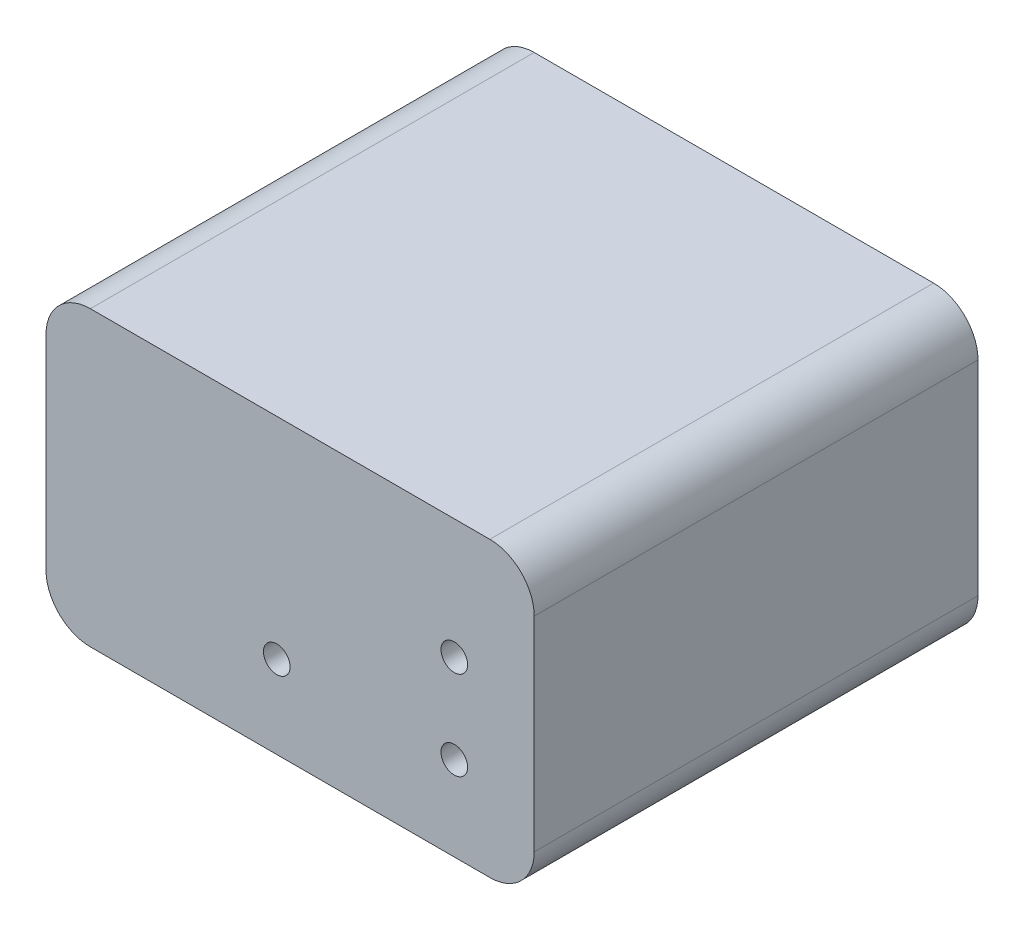
ISO-10303-21;
HEADER;
FILE_DESCRIPTION(('STEP AP214'),'2;1');
FILE_NAME('part.step','',(''),(''),'','','');
FILE_SCHEMA(('AUTOMOTIVE_DESIGN { 1 0 10303 214 1 1 1 1 }'));
ENDSEC;
DATA;
#1=APPLICATION_CONTEXT('core data for automotive mechanical design processes');
#2=APPLICATION_PROTOCOL_DEFINITION('international standard','automotive_design',2000,#1);
#3=PRODUCT_CONTEXT('',#1,'mechanical');
#4=PRODUCT('Part','Part','',(#3));
#5=PRODUCT_RELATED_PRODUCT_CATEGORY('part','',(#4));
#6=PRODUCT_DEFINITION_FORMATION('','',#4);
#7=PRODUCT_DEFINITION_CONTEXT('part definition',#1,'design');
#8=PRODUCT_DEFINITION('design','',#6,#7);
#9=PRODUCT_DEFINITION_SHAPE('','',#8);
#10=(LENGTH_UNIT() NAMED_UNIT(*) SI_UNIT(.MILLI.,.METRE.));
#11=(NAMED_UNIT(*) PLANE_ANGLE_UNIT() SI_UNIT($,.RADIAN.));
#12=(NAMED_UNIT(*) SI_UNIT($,.STERADIAN.) SOLID_ANGLE_UNIT());
#13=UNCERTAINTY_MEASURE_WITH_UNIT(LENGTH_MEASURE(1.E-05),#10,'distance_accuracy_value','');
#14=(GEOMETRIC_REPRESENTATION_CONTEXT(3) GLOBAL_UNCERTAINTY_ASSIGNED_CONTEXT((#13)) GLOBAL_UNIT_ASSIGNED_CONTEXT((#10,
#11,#12)) REPRESENTATION_CONTEXT('',''));
#15=CARTESIAN_POINT('',(0.,0.,0.));
#16=DIRECTION('',(0.,0.,1.));
#17=DIRECTION('',(1.,0.,0.));
#18=AXIS2_PLACEMENT_3D('',#15,#16,#17);
#19=CARTESIAN_POINT('',(-8.99999999999999,9.49999999999999,40.));
#20=DIRECTION('',(0.,0.,1.));
#21=DIRECTION('',(1.,0.,0.));
#22=AXIS2_PLACEMENT_3D('',#19,#20,#21);
#23=CYLINDRICAL_SURFACE('',#22,1.5);
#24=CARTESIAN_POINT('',(-8.99999999999999,9.49999999999999,50.));
#25=DIRECTION('',(0.,0.,1.));
#26=DIRECTION('',(1.,0.,0.));
#27=AXIS2_PLACEMENT_3D('',#24,#25,#26);
#28=CIRCLE('',#27,1.5);
#29=CARTESIAN_POINT('',(-7.49999999999999,9.49999999999999,50.));
#30=VERTEX_POINT('',#29);
#31=EDGE_CURVE('E387',#30,#30,#28,.T.);
#32=ORIENTED_EDGE('',*,*,#31,.T.);
#33=EDGE_LOOP('',(#32));
#34=FACE_BOUND('',#33,.T.);
#35=CARTESIAN_POINT('',(-8.99999999999999,9.49999999999999,47.));
#36=DIRECTION('',(0.,0.,-1.));
#37=DIRECTION('',(-1.,0.,0.));
#38=AXIS2_PLACEMENT_3D('',#35,#36,#37);
#39=CIRCLE('',#38,1.5);
#40=CARTESIAN_POINT('',(-10.5,9.49999999999999,47.));
#41=VERTEX_POINT('',#40);
#42=EDGE_CURVE('E37',#41,#41,#39,.F.);
#43=ORIENTED_EDGE('',*,*,#42,.F.);
#44=EDGE_LOOP('',(#43));
#45=FACE_BOUND('',#44,.T.);
#46=ADVANCED_FACE('F33',(#34,#45),#23,.F.);
#47=CARTESIAN_POINT('',(-8.99999999999988,19.5,40.));
#48=DIRECTION('',(0.,0.,1.));
#49=DIRECTION('',(1.,0.,0.));
#50=AXIS2_PLACEMENT_3D('',#47,#48,#49);
#51=CYLINDRICAL_SURFACE('',#50,1.5);
#52=CARTESIAN_POINT('',(-8.99999999999988,19.5,50.));
#53=DIRECTION('',(0.,0.,1.));
#54=DIRECTION('',(1.,0.,0.));
#55=AXIS2_PLACEMENT_3D('',#52,#53,#54);
#56=CIRCLE('',#55,1.5);
#57=CARTESIAN_POINT('',(-7.49999999999988,19.5,50.));
#58=VERTEX_POINT('',#57);
#59=EDGE_CURVE('E383',#58,#58,#56,.T.);
#60=ORIENTED_EDGE('',*,*,#59,.T.);
#61=EDGE_LOOP('',(#60));
#62=FACE_BOUND('',#61,.T.);
#63=CARTESIAN_POINT('',(-8.99999999999988,19.5,47.));
#64=DIRECTION('',(0.,0.,-1.));
#65=DIRECTION('',(-1.,0.,0.));
#66=AXIS2_PLACEMENT_3D('',#63,#64,#65);
#67=CIRCLE('',#66,1.5);
#68=CARTESIAN_POINT('',(-10.4999999999999,19.5,47.));
#69=VERTEX_POINT('',#68);
#70=EDGE_CURVE('E281',#69,#69,#67,.F.);
#71=ORIENTED_EDGE('',*,*,#70,.F.);
#72=EDGE_LOOP('',(#71));
#73=FACE_BOUND('',#72,.T.);
#74=ADVANCED_FACE('F487',(#62,#73),#51,.F.);
#75=CARTESIAN_POINT('',(-28.9999999999998,9.30000000000136,40.));
#76=DIRECTION('',(0.,0.,1.));
#77=DIRECTION('',(1.,0.,0.));
#78=AXIS2_PLACEMENT_3D('',#75,#76,#77);
#79=CYLINDRICAL_SURFACE('',#78,1.5);
#80=CARTESIAN_POINT('',(-28.9999999999998,9.30000000000136,50.));
#81=DIRECTION('',(0.,0.,1.));
#82=DIRECTION('',(1.,0.,0.));
#83=AXIS2_PLACEMENT_3D('',#80,#81,#82);
#84=CIRCLE('',#83,1.5);
#85=CARTESIAN_POINT('',(-27.4999999999998,9.30000000000136,50.));
#86=VERTEX_POINT('',#85);
#87=EDGE_CURVE('E386',#86,#86,#84,.T.);
#88=ORIENTED_EDGE('',*,*,#87,.T.);
#89=EDGE_LOOP('',(#88));
#90=FACE_BOUND('',#89,.T.);
#91=CARTESIAN_POINT('',(-28.9999999999998,9.30000000000136,47.));
#92=DIRECTION('',(0.,0.,-1.));
#93=DIRECTION('',(-1.,0.,0.));
#94=AXIS2_PLACEMENT_3D('',#91,#92,#93);
#95=CIRCLE('',#94,1.5);
#96=CARTESIAN_POINT('',(-30.4999999999998,9.30000000000136,47.));
#97=VERTEX_POINT('',#96);
#98=EDGE_CURVE('E372',#97,#97,#95,.F.);
#99=ORIENTED_EDGE('',*,*,#98,.F.);
#100=EDGE_LOOP('',(#99));
#101=FACE_BOUND('',#100,.T.);
#102=ADVANCED_FACE('F493',(#90,#101),#79,.F.);
#103=CARTESIAN_POINT('',(0.,0.,0.));
#104=DIRECTION('',(0.,0.,1.));
#105=DIRECTION('',(1.,0.,0.));
#106=AXIS2_PLACEMENT_3D('',#103,#104,#105);
#107=PLANE('',#106);
#108=DIRECTION('',(0.,-1.,0.));
#109=VECTOR('',#108,1.);
#110=CARTESIAN_POINT('',(-55.,0.,0.));
#111=LINE('',#110,#109);
#112=CARTESIAN_POINT('',(-55.,28.,0.));
#113=VERTEX_POINT('',#112);
#114=CARTESIAN_POINT('',(-55.,4.99999999999999,0.));
#115=VERTEX_POINT('',#114);
#116=EDGE_CURVE('E443',#113,#115,#111,.T.);
#117=ORIENTED_EDGE('',*,*,#116,.F.);
#118=CARTESIAN_POINT('',(-50.,28.,0.));
#119=DIRECTION('',(0.,0.,1.));
#120=DIRECTION('',(1.,0.,0.));
#121=AXIS2_PLACEMENT_3D('',#118,#119,#120);
#122=CIRCLE('',#121,5.);
#123=CARTESIAN_POINT('',(-50.,33.,0.));
#124=VERTEX_POINT('',#123);
#125=EDGE_CURVE('E458',#113,#124,#122,.F.);
#126=ORIENTED_EDGE('',*,*,#125,.T.);
#127=DIRECTION('',(-1.,0.,0.));
#128=VECTOR('',#127,1.);
#129=CARTESIAN_POINT('',(0.,33.,0.));
#130=LINE('',#129,#128);
#131=CARTESIAN_POINT('',(-5.,33.,0.));
#132=VERTEX_POINT('',#131);
#133=EDGE_CURVE('E440',#132,#124,#130,.T.);
#134=ORIENTED_EDGE('',*,*,#133,.F.);
#135=CARTESIAN_POINT('',(-5.,28.,0.));
#136=DIRECTION('',(0.,0.,1.));
#137=DIRECTION('',(1.,0.,0.));
#138=AXIS2_PLACEMENT_3D('',#135,#136,#137);
#139=CIRCLE('',#138,5.);
#140=CARTESIAN_POINT('',(0.,28.,0.));
#141=VERTEX_POINT('',#140);
#142=EDGE_CURVE('E452',#132,#141,#139,.F.);
#143=ORIENTED_EDGE('',*,*,#142,.T.);
#144=DIRECTION('',(0.,1.,0.));
#145=VECTOR('',#144,1.);
#146=CARTESIAN_POINT('',(0.,0.,0.));
#147=LINE('',#146,#145);
#148=CARTESIAN_POINT('',(0.,5.,0.));
#149=VERTEX_POINT('',#148);
#150=EDGE_CURVE('E423',#149,#141,#147,.T.);
#151=ORIENTED_EDGE('',*,*,#150,.F.);
#152=CARTESIAN_POINT('',(-5.,5.,0.));
#153=DIRECTION('',(0.,0.,1.));
#154=DIRECTION('',(1.,0.,0.));
#155=AXIS2_PLACEMENT_3D('',#152,#153,#154);
#156=CIRCLE('',#155,5.);
#157=CARTESIAN_POINT('',(-5.,0.,0.));
#158=VERTEX_POINT('',#157);
#159=EDGE_CURVE('E454',#149,#158,#156,.F.);
#160=ORIENTED_EDGE('',*,*,#159,.T.);
#161=DIRECTION('',(1.,0.,0.));
#162=VECTOR('',#161,1.);
#163=CARTESIAN_POINT('',(0.,0.,0.));
#164=LINE('',#163,#162);
#165=CARTESIAN_POINT('',(-50.,0.,0.));
#166=VERTEX_POINT('',#165);
#167=EDGE_CURVE('E428',#166,#158,#164,.T.);
#168=ORIENTED_EDGE('',*,*,#167,.F.);
#169=CARTESIAN_POINT('',(-50.,4.99999999999999,0.));
#170=DIRECTION('',(0.,0.,1.));
#171=DIRECTION('',(1.,0.,0.));
#172=AXIS2_PLACEMENT_3D('',#169,#170,#171);
#173=CIRCLE('',#172,5.);
#174=EDGE_CURVE('E456',#166,#115,#173,.F.);
#175=ORIENTED_EDGE('',*,*,#174,.T.);
#176=EDGE_LOOP('',(#117,#126,#134,#143,#151,#160,#168,#175));
#177=FACE_BOUND('',#176,.T.);
#178=CARTESIAN_POINT('',(-39.,16.,0.));
#179=DIRECTION('',(0.,0.,1.));
#180=DIRECTION('',(1.,0.,0.));
#181=AXIS2_PLACEMENT_3D('',#178,#179,#180);
#182=CIRCLE('',#181,13.);
#183=CARTESIAN_POINT('',(-39.,29.,0.));
#184=VERTEX_POINT('',#183);
#185=CARTESIAN_POINT('',(-39.,2.99999999999999,0.));
#186=VERTEX_POINT('',#185);
#187=EDGE_CURVE('E392',#184,#186,#182,.T.);
#188=ORIENTED_EDGE('',*,*,#187,.T.);
#189=DIRECTION('',(1.,0.,0.));
#190=VECTOR('',#189,1.);
#191=CARTESIAN_POINT('',(-39.,2.99999999999999,0.));
#192=LINE('',#191,#190);
#193=CARTESIAN_POINT('',(-16.,2.99999999999999,0.));
#194=VERTEX_POINT('',#193);
#195=EDGE_CURVE('E406',#186,#194,#192,.T.);
#196=ORIENTED_EDGE('',*,*,#195,.T.);
#197=CARTESIAN_POINT('',(-16.,16.,0.));
#198=DIRECTION('',(0.,0.,1.));
#199=DIRECTION('',(1.,0.,0.));
#200=AXIS2_PLACEMENT_3D('',#197,#198,#199);
#201=CIRCLE('',#200,13.);
#202=CARTESIAN_POINT('',(-16.,29.,0.));
#203=VERTEX_POINT('',#202);
#204=EDGE_CURVE('E409',#194,#203,#201,.T.);
#205=ORIENTED_EDGE('',*,*,#204,.T.);
#206=DIRECTION('',(-1.,0.,0.));
#207=VECTOR('',#206,1.);
#208=CARTESIAN_POINT('',(-39.,29.,0.));
#209=LINE('',#208,#207);
#210=EDGE_CURVE('E397',#203,#184,#209,.T.);
#211=ORIENTED_EDGE('',*,*,#210,.T.);
#212=EDGE_LOOP('',(#188,#196,#205,#211));
#213=FACE_BOUND('',#212,.T.);
#214=ADVANCED_FACE('F500',(#177,#213),#107,.F.);
#215=CARTESIAN_POINT('',(0.,0.,50.));
#216=DIRECTION('',(-1.,0.,0.));
#217=DIRECTION('',(0.,0.,1.));
#218=AXIS2_PLACEMENT_3D('',#215,#216,#217);
#219=PLANE('',#218);
#220=DIRECTION('',(0.,1.,0.));
#221=VECTOR('',#220,1.);
#222=CARTESIAN_POINT('',(0.,0.,50.));
#223=LINE('',#222,#221);
#224=CARTESIAN_POINT('',(0.,5.,50.));
#225=VERTEX_POINT('',#224);
#226=CARTESIAN_POINT('',(0.,28.,50.));
#227=VERTEX_POINT('',#226);
#228=EDGE_CURVE('E424',#225,#227,#223,.T.);
#229=ORIENTED_EDGE('',*,*,#228,.F.);
#230=DIRECTION('',(0.,0.,-1.));
#231=VECTOR('',#230,1.);
#232=CARTESIAN_POINT('',(0.,5.,50.));
#233=LINE('',#232,#231);
#234=EDGE_CURVE('E11',#225,#149,#233,.T.);
#235=ORIENTED_EDGE('',*,*,#234,.T.);
#236=ORIENTED_EDGE('',*,*,#150,.T.);
#237=DIRECTION('',(0.,0.,-1.));
#238=VECTOR('',#237,1.);
#239=CARTESIAN_POINT('',(0.,28.,50.));
#240=LINE('',#239,#238);
#241=EDGE_CURVE('E42',#141,#227,#240,.F.);
#242=ORIENTED_EDGE('',*,*,#241,.T.);
#243=EDGE_LOOP('',(#229,#235,#236,#242));
#244=FACE_BOUND('',#243,.T.);
#245=ADVANCED_FACE('F530',(#244),#219,.F.);
#246=CARTESIAN_POINT('',(0.,33.,50.));
#247=DIRECTION('',(0.,-1.,0.));
#248=DIRECTION('',(1.,0.,0.));
#249=AXIS2_PLACEMENT_3D('',#246,#247,#248);
#250=PLANE('',#249);
#251=ORIENTED_EDGE('',*,*,#133,.T.);
#252=DIRECTION('',(0.,0.,-1.));
#253=VECTOR('',#252,1.);
#254=CARTESIAN_POINT('',(-50.,33.,50.));
#255=LINE('',#254,#253);
#256=CARTESIAN_POINT('',(-50.,33.,50.));
#257=VERTEX_POINT('',#256);
#258=EDGE_CURVE('E463',#124,#257,#255,.F.);
#259=ORIENTED_EDGE('',*,*,#258,.T.);
#260=DIRECTION('',(-1.,0.,0.));
#261=VECTOR('',#260,1.);
#262=CARTESIAN_POINT('',(0.,33.,50.));
#263=LINE('',#262,#261);
#264=CARTESIAN_POINT('',(-5.,33.,50.));
#265=VERTEX_POINT('',#264);
#266=EDGE_CURVE('E427',#265,#257,#263,.T.);
#267=ORIENTED_EDGE('',*,*,#266,.F.);
#268=DIRECTION('',(0.,0.,-1.));
#269=VECTOR('',#268,1.);
#270=CARTESIAN_POINT('',(-5.,33.,50.));
#271=LINE('',#270,#269);
#272=EDGE_CURVE('E460',#265,#132,#271,.T.);
#273=ORIENTED_EDGE('',*,*,#272,.T.);
#274=EDGE_LOOP('',(#251,#259,#267,#273));
#275=FACE_BOUND('',#274,.T.);
#276=ADVANCED_FACE('F538',(#275),#250,.F.);
#277=CARTESIAN_POINT('',(-55.,0.,50.));
#278=DIRECTION('',(1.,0.,0.));
#279=DIRECTION('',(0.,0.,-1.));
#280=AXIS2_PLACEMENT_3D('',#277,#278,#279);
#281=PLANE('',#280);
#282=DIRECTION('',(0.,-1.,0.));
#283=VECTOR('',#282,1.);
#284=CARTESIAN_POINT('',(-55.,0.,50.));
#285=LINE('',#284,#283);
#286=CARTESIAN_POINT('',(-55.,28.,50.));
#287=VERTEX_POINT('',#286);
#288=CARTESIAN_POINT('',(-55.,4.99999999999999,50.));
#289=VERTEX_POINT('',#288);
#290=EDGE_CURVE('E431',#287,#289,#285,.T.);
#291=ORIENTED_EDGE('',*,*,#290,.F.);
#292=DIRECTION('',(0.,0.,-1.));
#293=VECTOR('',#292,1.);
#294=CARTESIAN_POINT('',(-55.,28.,50.));
#295=LINE('',#294,#293);
#296=EDGE_CURVE('E449',#287,#113,#295,.T.);
#297=ORIENTED_EDGE('',*,*,#296,.T.);
#298=ORIENTED_EDGE('',*,*,#116,.T.);
#299=DIRECTION('',(0.,0.,-1.));
#300=VECTOR('',#299,1.);
#301=CARTESIAN_POINT('',(-55.,4.99999999999999,50.));
#302=LINE('',#301,#300);
#303=EDGE_CURVE('E437',#115,#289,#302,.F.);
#304=ORIENTED_EDGE('',*,*,#303,.T.);
#305=EDGE_LOOP('',(#291,#297,#298,#304));
#306=FACE_BOUND('',#305,.T.);
#307=ADVANCED_FACE('F534',(#306),#281,.F.);
#308=CARTESIAN_POINT('',(0.,0.,50.));
#309=DIRECTION('',(0.,1.,0.));
#310=DIRECTION('',(-1.,0.,0.));
#311=AXIS2_PLACEMENT_3D('',#308,#309,#310);
#312=PLANE('',#311);
#313=DIRECTION('',(1.,0.,0.));
#314=VECTOR('',#313,1.);
#315=CARTESIAN_POINT('',(0.,0.,50.));
#316=LINE('',#315,#314);
#317=CARTESIAN_POINT('',(-50.,0.,50.));
#318=VERTEX_POINT('',#317);
#319=CARTESIAN_POINT('',(-5.,0.,50.));
#320=VERTEX_POINT('',#319);
#321=EDGE_CURVE('E434',#318,#320,#316,.T.);
#322=ORIENTED_EDGE('',*,*,#321,.F.);
#323=DIRECTION('',(0.,0.,-1.));
#324=VECTOR('',#323,1.);
#325=CARTESIAN_POINT('',(-50.,0.,50.));
#326=LINE('',#325,#324);
#327=EDGE_CURVE('E475',#318,#166,#326,.T.);
#328=ORIENTED_EDGE('',*,*,#327,.T.);
#329=ORIENTED_EDGE('',*,*,#167,.T.);
#330=DIRECTION('',(0.,0.,-1.));
#331=VECTOR('',#330,1.);
#332=CARTESIAN_POINT('',(-5.,0.,50.));
#333=LINE('',#332,#331);
#334=EDGE_CURVE('E473',#158,#320,#333,.F.);
#335=ORIENTED_EDGE('',*,*,#334,.T.);
#336=EDGE_LOOP('',(#322,#328,#329,#335));
#337=FACE_BOUND('',#336,.T.);
#338=ADVANCED_FACE('F526',(#337),#312,.F.);
#339=CARTESIAN_POINT('',(0.,0.,50.));
#340=DIRECTION('',(0.,0.,1.));
#341=DIRECTION('',(1.,0.,0.));
#342=AXIS2_PLACEMENT_3D('',#339,#340,#341);
#343=PLANE('',#342);
#344=ORIENTED_EDGE('',*,*,#59,.F.);
#345=EDGE_LOOP('',(#344));
#346=FACE_BOUND('',#345,.T.);
#347=ORIENTED_EDGE('',*,*,#31,.F.);
#348=EDGE_LOOP('',(#347));
#349=FACE_BOUND('',#348,.T.);
#350=ORIENTED_EDGE('',*,*,#87,.F.);
#351=EDGE_LOOP('',(#350));
#352=FACE_BOUND('',#351,.T.);
#353=ORIENTED_EDGE('',*,*,#266,.T.);
#354=CARTESIAN_POINT('',(-50.,28.,50.));
#355=DIRECTION('',(0.,0.,1.));
#356=DIRECTION('',(1.,0.,0.));
#357=AXIS2_PLACEMENT_3D('',#354,#355,#356);
#358=CIRCLE('',#357,5.);
#359=EDGE_CURVE('E471',#257,#287,#358,.T.);
#360=ORIENTED_EDGE('',*,*,#359,.T.);
#361=ORIENTED_EDGE('',*,*,#290,.T.);
#362=CARTESIAN_POINT('',(-50.,4.99999999999999,50.));
#363=DIRECTION('',(0.,0.,1.));
#364=DIRECTION('',(1.,0.,0.));
#365=AXIS2_PLACEMENT_3D('',#362,#363,#364);
#366=CIRCLE('',#365,5.);
#367=EDGE_CURVE('E469',#289,#318,#366,.T.);
#368=ORIENTED_EDGE('',*,*,#367,.T.);
#369=ORIENTED_EDGE('',*,*,#321,.T.);
#370=CARTESIAN_POINT('',(-5.,5.,50.));
#371=DIRECTION('',(0.,0.,1.));
#372=DIRECTION('',(1.,0.,0.));
#373=AXIS2_PLACEMENT_3D('',#370,#371,#372);
#374=CIRCLE('',#373,5.);
#375=EDGE_CURVE('E467',#320,#225,#374,.T.);
#376=ORIENTED_EDGE('',*,*,#375,.T.);
#377=ORIENTED_EDGE('',*,*,#228,.T.);
#378=CARTESIAN_POINT('',(-5.,28.,50.));
#379=DIRECTION('',(0.,0.,1.));
#380=DIRECTION('',(1.,0.,0.));
#381=AXIS2_PLACEMENT_3D('',#378,#379,#380);
#382=CIRCLE('',#381,5.);
#383=EDGE_CURVE('E465',#227,#265,#382,.T.);
#384=ORIENTED_EDGE('',*,*,#383,.T.);
#385=EDGE_LOOP('',(#353,#360,#361,#368,#369,#376,#377,#384));
#386=FACE_BOUND('',#385,.T.);
#387=ADVANCED_FACE('F522',(#346,#349,#352,#386),#343,.T.);
#388=CARTESIAN_POINT('',(-39.,16.,45.));
#389=DIRECTION('',(0.,0.,-1.));
#390=DIRECTION('',(-1.,0.,0.));
#391=AXIS2_PLACEMENT_3D('',#388,#389,#390);
#392=CYLINDRICAL_SURFACE('',#391,13.);
#393=ORIENTED_EDGE('',*,*,#187,.F.);
#394=DIRECTION('',(0.,0.,-1.));
#395=VECTOR('',#394,1.);
#396=CARTESIAN_POINT('',(-39.,29.,45.));
#397=LINE('',#396,#395);
#398=CARTESIAN_POINT('',(-39.,29.,45.));
#399=VERTEX_POINT('',#398);
#400=EDGE_CURVE('E403',#399,#184,#397,.T.);
#401=ORIENTED_EDGE('',*,*,#400,.F.);
#402=CARTESIAN_POINT('',(-39.,16.,45.));
#403=DIRECTION('',(0.,0.,1.));
#404=DIRECTION('',(1.,0.,0.));
#405=AXIS2_PLACEMENT_3D('',#402,#403,#404);
#406=CIRCLE('',#405,13.);
#407=CARTESIAN_POINT('',(-39.,2.99999999999999,45.));
#408=VERTEX_POINT('',#407);
#409=EDGE_CURVE('E393',#399,#408,#406,.T.);
#410=ORIENTED_EDGE('',*,*,#409,.T.);
#411=DIRECTION('',(0.,0.,-1.));
#412=VECTOR('',#411,1.);
#413=CARTESIAN_POINT('',(-39.,2.99999999999999,45.));
#414=LINE('',#413,#412);
#415=EDGE_CURVE('E420',#408,#186,#414,.T.);
#416=ORIENTED_EDGE('',*,*,#415,.T.);
#417=EDGE_LOOP('',(#393,#401,#410,#416));
#418=FACE_BOUND('',#417,.T.);
#419=ADVANCED_FACE('F518',(#418),#392,.F.);
#420=CARTESIAN_POINT('',(-39.,2.99999999999999,45.));
#421=DIRECTION('',(0.,1.,0.));
#422=DIRECTION('',(0.,0.,1.));
#423=AXIS2_PLACEMENT_3D('',#420,#421,#422);
#424=PLANE('',#423);
#425=ORIENTED_EDGE('',*,*,#195,.F.);
#426=ORIENTED_EDGE('',*,*,#415,.F.);
#427=DIRECTION('',(1.,0.,0.));
#428=VECTOR('',#427,1.);
#429=CARTESIAN_POINT('',(-39.,2.99999999999999,45.));
#430=LINE('',#429,#428);
#431=CARTESIAN_POINT('',(-16.,2.99999999999999,45.));
#432=VERTEX_POINT('',#431);
#433=EDGE_CURVE('E396',#408,#432,#430,.T.);
#434=ORIENTED_EDGE('',*,*,#433,.T.);
#435=DIRECTION('',(0.,0.,-1.));
#436=VECTOR('',#435,1.);
#437=CARTESIAN_POINT('',(-16.,2.99999999999999,45.));
#438=LINE('',#437,#436);
#439=EDGE_CURVE('E418',#432,#194,#438,.T.);
#440=ORIENTED_EDGE('',*,*,#439,.T.);
#441=EDGE_LOOP('',(#425,#426,#434,#440));
#442=FACE_BOUND('',#441,.T.);
#443=ADVANCED_FACE('F514',(#442),#424,.T.);
#444=CARTESIAN_POINT('',(-16.,16.,45.));
#445=DIRECTION('',(0.,0.,-1.));
#446=DIRECTION('',(-1.,0.,0.));
#447=AXIS2_PLACEMENT_3D('',#444,#445,#446);
#448=CYLINDRICAL_SURFACE('',#447,13.);
#449=ORIENTED_EDGE('',*,*,#204,.F.);
#450=ORIENTED_EDGE('',*,*,#439,.F.);
#451=CARTESIAN_POINT('',(-16.,16.,45.));
#452=DIRECTION('',(0.,0.,1.));
#453=DIRECTION('',(1.,0.,0.));
#454=AXIS2_PLACEMENT_3D('',#451,#452,#453);
#455=CIRCLE('',#454,13.);
#456=CARTESIAN_POINT('',(-16.,29.,45.));
#457=VERTEX_POINT('',#456);
#458=EDGE_CURVE('E399',#432,#457,#455,.T.);
#459=ORIENTED_EDGE('',*,*,#458,.T.);
#460=DIRECTION('',(0.,0.,-1.));
#461=VECTOR('',#460,1.);
#462=CARTESIAN_POINT('',(-16.,29.,45.));
#463=LINE('',#462,#461);
#464=EDGE_CURVE('E416',#457,#203,#463,.T.);
#465=ORIENTED_EDGE('',*,*,#464,.T.);
#466=EDGE_LOOP('',(#449,#450,#459,#465));
#467=FACE_BOUND('',#466,.T.);
#468=ADVANCED_FACE('F510',(#467),#448,.F.);
#469=CARTESIAN_POINT('',(-39.,29.,45.));
#470=DIRECTION('',(0.,-1.,0.));
#471=DIRECTION('',(0.,0.,-1.));
#472=AXIS2_PLACEMENT_3D('',#469,#470,#471);
#473=PLANE('',#472);
#474=ORIENTED_EDGE('',*,*,#210,.F.);
#475=ORIENTED_EDGE('',*,*,#464,.F.);
#476=DIRECTION('',(-1.,0.,0.));
#477=VECTOR('',#476,1.);
#478=CARTESIAN_POINT('',(-39.,29.,45.));
#479=LINE('',#478,#477);
#480=EDGE_CURVE('E401',#457,#399,#479,.T.);
#481=ORIENTED_EDGE('',*,*,#480,.T.);
#482=ORIENTED_EDGE('',*,*,#400,.T.);
#483=EDGE_LOOP('',(#474,#475,#481,#482));
#484=FACE_BOUND('',#483,.T.);
#485=ADVANCED_FACE('F506',(#484),#473,.T.);
#486=CARTESIAN_POINT('',(-39.,16.,45.));
#487=DIRECTION('',(0.,0.,1.));
#488=DIRECTION('',(1.,0.,0.));
#489=AXIS2_PLACEMENT_3D('',#486,#487,#488);
#490=PLANE('',#489);
#491=DIRECTION('',(-1.,0.,0.));
#492=VECTOR('',#491,1.);
#493=CARTESIAN_POINT('',(-7.35455173280956,6.64999999999998,45.));
#494=LINE('',#493,#492);
#495=CARTESIAN_POINT('',(-7.35455173280956,6.64999999999998,45.));
#496=VERTEX_POINT('',#495);
#497=CARTESIAN_POINT('',(-10.6454482671904,6.64999999999998,45.));
#498=VERTEX_POINT('',#497);
#499=EDGE_CURVE('E268',#496,#498,#494,.T.);
#500=ORIENTED_EDGE('',*,*,#499,.F.);
#501=DIRECTION('',(-0.5,-0.866025403784439,0.));
#502=VECTOR('',#501,1.);
#503=CARTESIAN_POINT('',(-5.70910346561913,9.49999999999999,45.));
#504=LINE('',#503,#502);
#505=CARTESIAN_POINT('',(-5.70910346561913,9.49999999999999,45.));
#506=VERTEX_POINT('',#505);
#507=EDGE_CURVE('E50',#506,#496,#504,.T.);
#508=ORIENTED_EDGE('',*,*,#507,.F.);
#509=DIRECTION('',(0.5,-0.866025403784439,0.));
#510=VECTOR('',#509,1.);
#511=CARTESIAN_POINT('',(-7.35455173280956,12.35,45.));
#512=LINE('',#511,#510);
#513=CARTESIAN_POINT('',(-7.35455173280956,12.35,45.));
#514=VERTEX_POINT('',#513);
#515=EDGE_CURVE('E254',#514,#506,#512,.T.);
#516=ORIENTED_EDGE('',*,*,#515,.F.);
#517=DIRECTION('',(1.,0.,0.));
#518=VECTOR('',#517,1.);
#519=CARTESIAN_POINT('',(-10.6454482671904,12.35,45.));
#520=LINE('',#519,#518);
#521=CARTESIAN_POINT('',(-10.6454482671904,12.35,45.));
#522=VERTEX_POINT('',#521);
#523=EDGE_CURVE('E257',#522,#514,#520,.T.);
#524=ORIENTED_EDGE('',*,*,#523,.F.);
#525=DIRECTION('',(0.5,0.866025403784439,0.));
#526=VECTOR('',#525,1.);
#527=CARTESIAN_POINT('',(-12.2908965343809,9.49999999999999,45.));
#528=LINE('',#527,#526);
#529=CARTESIAN_POINT('',(-12.2908965343809,9.49999999999999,45.));
#530=VERTEX_POINT('',#529);
#531=EDGE_CURVE('E274',#530,#522,#528,.T.);
#532=ORIENTED_EDGE('',*,*,#531,.F.);
#533=DIRECTION('',(-0.500000000000001,0.866025403784438,0.));
#534=VECTOR('',#533,1.);
#535=CARTESIAN_POINT('',(-10.6454482671904,6.64999999999998,45.));
#536=LINE('',#535,#534);
#537=EDGE_CURVE('E271',#498,#530,#536,.T.);
#538=ORIENTED_EDGE('',*,*,#537,.F.);
#539=EDGE_LOOP('',(#500,#508,#516,#524,#532,#538));
#540=FACE_BOUND('',#539,.T.);
#541=DIRECTION('',(-1.,0.,0.));
#542=VECTOR('',#541,1.);
#543=CARTESIAN_POINT('',(-7.35455173280944,16.65,45.));
#544=LINE('',#543,#542);
#545=CARTESIAN_POINT('',(-7.35455173280945,16.65,45.));
#546=VERTEX_POINT('',#545);
#547=CARTESIAN_POINT('',(-10.6454482671903,16.65,45.));
#548=VERTEX_POINT('',#547);
#549=EDGE_CURVE('E310',#546,#548,#544,.T.);
#550=ORIENTED_EDGE('',*,*,#549,.F.);
#551=DIRECTION('',(-0.5,-0.866025403784439,0.));
#552=VECTOR('',#551,1.);
#553=CARTESIAN_POINT('',(-5.70910346561901,19.5,45.));
#554=LINE('',#553,#552);
#555=CARTESIAN_POINT('',(-5.70910346561901,19.5,45.));
#556=VERTEX_POINT('',#555);
#557=EDGE_CURVE('E58',#556,#546,#554,.T.);
#558=ORIENTED_EDGE('',*,*,#557,.F.);
#559=DIRECTION('',(0.5,-0.866025403784439,0.));
#560=VECTOR('',#559,1.);
#561=CARTESIAN_POINT('',(-7.35455173280944,22.35,45.));
#562=LINE('',#561,#560);
#563=CARTESIAN_POINT('',(-7.35455173280944,22.35,45.));
#564=VERTEX_POINT('',#563);
#565=EDGE_CURVE('E293',#564,#556,#562,.T.);
#566=ORIENTED_EDGE('',*,*,#565,.F.);
#567=DIRECTION('',(1.,0.,0.));
#568=VECTOR('',#567,1.);
#569=CARTESIAN_POINT('',(-10.6454482671903,22.35,45.));
#570=LINE('',#569,#568);
#571=CARTESIAN_POINT('',(-10.6454482671903,22.35,45.));
#572=VERTEX_POINT('',#571);
#573=EDGE_CURVE('E319',#572,#564,#570,.T.);
#574=ORIENTED_EDGE('',*,*,#573,.F.);
#575=DIRECTION('',(0.499999999999999,0.866025403784439,0.));
#576=VECTOR('',#575,1.);
#577=CARTESIAN_POINT('',(-12.2908965343808,19.5,45.));
#578=LINE('',#577,#576);
#579=CARTESIAN_POINT('',(-12.2908965343808,19.5,45.));
#580=VERTEX_POINT('',#579);
#581=EDGE_CURVE('E316',#580,#572,#578,.T.);
#582=ORIENTED_EDGE('',*,*,#581,.F.);
#583=DIRECTION('',(-0.5,0.866025403784439,0.));
#584=VECTOR('',#583,1.);
#585=CARTESIAN_POINT('',(-10.6454482671903,16.65,45.));
#586=LINE('',#585,#584);
#587=EDGE_CURVE('E313',#548,#580,#586,.T.);
#588=ORIENTED_EDGE('',*,*,#587,.F.);
#589=EDGE_LOOP('',(#550,#558,#566,#574,#582,#588));
#590=FACE_BOUND('',#589,.T.);
#591=DIRECTION('',(-1.,0.,0.));
#592=VECTOR('',#591,1.);
#593=CARTESIAN_POINT('',(-27.3545517328093,6.45000000000136,45.));
#594=LINE('',#593,#592);
#595=CARTESIAN_POINT('',(-27.3545517328093,6.45000000000136,45.));
#596=VERTEX_POINT('',#595);
#597=CARTESIAN_POINT('',(-30.6454482671902,6.45000000000136,45.));
#598=VERTEX_POINT('',#597);
#599=EDGE_CURVE('E356',#596,#598,#594,.T.);
#600=ORIENTED_EDGE('',*,*,#599,.F.);
#601=DIRECTION('',(-0.5,-0.866025403784439,0.));
#602=VECTOR('',#601,1.);
#603=CARTESIAN_POINT('',(-25.7091034656189,9.30000000000136,45.));
#604=LINE('',#603,#602);
#605=CARTESIAN_POINT('',(-25.7091034656189,9.30000000000136,45.));
#606=VERTEX_POINT('',#605);
#607=EDGE_CURVE('E354',#606,#596,#604,.T.);
#608=ORIENTED_EDGE('',*,*,#607,.F.);
#609=DIRECTION('',(0.5,-0.866025403784438,0.));
#610=VECTOR('',#609,1.);
#611=CARTESIAN_POINT('',(-27.3545517328093,12.1500000000014,45.));
#612=LINE('',#611,#610);
#613=CARTESIAN_POINT('',(-27.3545517328093,12.1500000000014,45.));
#614=VERTEX_POINT('',#613);
#615=EDGE_CURVE('E338',#614,#606,#612,.T.);
#616=ORIENTED_EDGE('',*,*,#615,.F.);
#617=DIRECTION('',(1.,0.,0.));
#618=VECTOR('',#617,1.);
#619=CARTESIAN_POINT('',(-30.6454482671902,12.1500000000014,45.));
#620=LINE('',#619,#618);
#621=CARTESIAN_POINT('',(-30.6454482671902,12.1500000000014,45.));
#622=VERTEX_POINT('',#621);
#623=EDGE_CURVE('E365',#622,#614,#620,.T.);
#624=ORIENTED_EDGE('',*,*,#623,.F.);
#625=DIRECTION('',(0.5,0.866025403784438,0.));
#626=VECTOR('',#625,1.);
#627=CARTESIAN_POINT('',(-32.2908965343806,9.30000000000136,45.));
#628=LINE('',#627,#626);
#629=CARTESIAN_POINT('',(-32.2908965343806,9.30000000000136,45.));
#630=VERTEX_POINT('',#629);
#631=EDGE_CURVE('E362',#630,#622,#628,.T.);
#632=ORIENTED_EDGE('',*,*,#631,.F.);
#633=DIRECTION('',(-0.5,0.866025403784439,0.));
#634=VECTOR('',#633,1.);
#635=CARTESIAN_POINT('',(-30.6454482671902,6.45000000000136,45.));
#636=LINE('',#635,#634);
#637=EDGE_CURVE('E359',#598,#630,#636,.T.);
#638=ORIENTED_EDGE('',*,*,#637,.F.);
#639=EDGE_LOOP('',(#600,#608,#616,#624,#632,#638));
#640=FACE_BOUND('',#639,.T.);
#641=ORIENTED_EDGE('',*,*,#409,.F.);
#642=ORIENTED_EDGE('',*,*,#480,.F.);
#643=ORIENTED_EDGE('',*,*,#458,.F.);
#644=ORIENTED_EDGE('',*,*,#433,.F.);
#645=EDGE_LOOP('',(#641,#642,#643,#644));
#646=FACE_BOUND('',#645,.T.);
#647=ADVANCED_FACE('F502',(#540,#590,#640,#646),#490,.F.);
#648=CARTESIAN_POINT('',(-50.,28.,50.));
#649=DIRECTION('',(0.,0.,-1.));
#650=DIRECTION('',(-1.,0.,0.));
#651=AXIS2_PLACEMENT_3D('',#648,#649,#650);
#652=CYLINDRICAL_SURFACE('',#651,5.);
#653=ORIENTED_EDGE('',*,*,#359,.F.);
#654=ORIENTED_EDGE('',*,*,#258,.F.);
#655=ORIENTED_EDGE('',*,*,#125,.F.);
#656=ORIENTED_EDGE('',*,*,#296,.F.);
#657=EDGE_LOOP('',(#653,#654,#655,#656));
#658=FACE_BOUND('',#657,.T.);
#659=ADVANCED_FACE('F505',(#658),#652,.T.);
#660=CARTESIAN_POINT('',(-50.,4.99999999999999,50.));
#661=DIRECTION('',(0.,0.,-1.));
#662=DIRECTION('',(-1.,0.,0.));
#663=AXIS2_PLACEMENT_3D('',#660,#661,#662);
#664=CYLINDRICAL_SURFACE('',#663,5.);
#665=ORIENTED_EDGE('',*,*,#367,.F.);
#666=ORIENTED_EDGE('',*,*,#303,.F.);
#667=ORIENTED_EDGE('',*,*,#174,.F.);
#668=ORIENTED_EDGE('',*,*,#327,.F.);
#669=EDGE_LOOP('',(#665,#666,#667,#668));
#670=FACE_BOUND('',#669,.T.);
#671=ADVANCED_FACE('F548',(#670),#664,.T.);
#672=CARTESIAN_POINT('',(-5.,5.,50.));
#673=DIRECTION('',(0.,0.,-1.));
#674=DIRECTION('',(-1.,0.,0.));
#675=AXIS2_PLACEMENT_3D('',#672,#673,#674);
#676=CYLINDRICAL_SURFACE('',#675,5.);
#677=ORIENTED_EDGE('',*,*,#375,.F.);
#678=ORIENTED_EDGE('',*,*,#334,.F.);
#679=ORIENTED_EDGE('',*,*,#159,.F.);
#680=ORIENTED_EDGE('',*,*,#234,.F.);
#681=EDGE_LOOP('',(#677,#678,#679,#680));
#682=FACE_BOUND('',#681,.T.);
#683=ADVANCED_FACE('F551',(#682),#676,.T.);
#684=CARTESIAN_POINT('',(-5.,28.,50.));
#685=DIRECTION('',(0.,0.,-1.));
#686=DIRECTION('',(-1.,0.,0.));
#687=AXIS2_PLACEMENT_3D('',#684,#685,#686);
#688=CYLINDRICAL_SURFACE('',#687,5.);
#689=ORIENTED_EDGE('',*,*,#383,.F.);
#690=ORIENTED_EDGE('',*,*,#241,.F.);
#691=ORIENTED_EDGE('',*,*,#142,.F.);
#692=ORIENTED_EDGE('',*,*,#272,.F.);
#693=EDGE_LOOP('',(#689,#690,#691,#692));
#694=FACE_BOUND('',#693,.T.);
#695=ADVANCED_FACE('F35',(#694),#688,.T.);
#696=CARTESIAN_POINT('',(0.,0.,47.));
#697=DIRECTION('',(0.,0.,-1.));
#698=DIRECTION('',(-1.,0.,0.));
#699=AXIS2_PLACEMENT_3D('',#696,#697,#698);
#700=PLANE('',#699);
#701=DIRECTION('',(-0.5,-0.866025403784439,0.));
#702=VECTOR('',#701,1.);
#703=CARTESIAN_POINT('',(-25.7091034656189,9.30000000000136,47.));
#704=LINE('',#703,#702);
#705=CARTESIAN_POINT('',(-25.7091034656189,9.30000000000136,47.));
#706=VERTEX_POINT('',#705);
#707=CARTESIAN_POINT('',(-27.3545517328093,6.45000000000136,47.));
#708=VERTEX_POINT('',#707);
#709=EDGE_CURVE('E334',#706,#708,#704,.T.);
#710=ORIENTED_EDGE('',*,*,#709,.T.);
#711=DIRECTION('',(-1.,0.,0.));
#712=VECTOR('',#711,1.);
#713=CARTESIAN_POINT('',(-27.3545517328093,6.45000000000136,47.));
#714=LINE('',#713,#712);
#715=CARTESIAN_POINT('',(-30.6454482671902,6.45000000000136,47.));
#716=VERTEX_POINT('',#715);
#717=EDGE_CURVE('E337',#708,#716,#714,.T.);
#718=ORIENTED_EDGE('',*,*,#717,.T.);
#719=DIRECTION('',(-0.5,0.866025403784439,0.));
#720=VECTOR('',#719,1.);
#721=CARTESIAN_POINT('',(-30.6454482671902,6.45000000000136,47.));
#722=LINE('',#721,#720);
#723=CARTESIAN_POINT('',(-32.2908965343806,9.30000000000136,47.));
#724=VERTEX_POINT('',#723);
#725=EDGE_CURVE('E341',#716,#724,#722,.T.);
#726=ORIENTED_EDGE('',*,*,#725,.T.);
#727=DIRECTION('',(0.5,0.866025403784438,0.));
#728=VECTOR('',#727,1.);
#729=CARTESIAN_POINT('',(-32.2908965343806,9.30000000000136,47.));
#730=LINE('',#729,#728);
#731=CARTESIAN_POINT('',(-30.6454482671902,12.1500000000014,47.));
#732=VERTEX_POINT('',#731);
#733=EDGE_CURVE('E344',#724,#732,#730,.T.);
#734=ORIENTED_EDGE('',*,*,#733,.T.);
#735=DIRECTION('',(1.,0.,0.));
#736=VECTOR('',#735,1.);
#737=CARTESIAN_POINT('',(-30.6454482671902,12.1500000000014,47.));
#738=LINE('',#737,#736);
#739=CARTESIAN_POINT('',(-27.3545517328093,12.1500000000014,47.));
#740=VERTEX_POINT('',#739);
#741=EDGE_CURVE('E347',#732,#740,#738,.T.);
#742=ORIENTED_EDGE('',*,*,#741,.T.);
#743=DIRECTION('',(0.5,-0.866025403784438,0.));
#744=VECTOR('',#743,1.);
#745=CARTESIAN_POINT('',(-27.3545517328093,12.1500000000014,47.));
#746=LINE('',#745,#744);
#747=EDGE_CURVE('E350',#740,#706,#746,.T.);
#748=ORIENTED_EDGE('',*,*,#747,.T.);
#749=EDGE_LOOP('',(#710,#718,#726,#734,#742,#748));
#750=FACE_BOUND('',#749,.T.);
#751=ORIENTED_EDGE('',*,*,#98,.T.);
#752=EDGE_LOOP('',(#751));
#753=FACE_BOUND('',#752,.T.);
#754=ADVANCED_FACE('F558',(#750,#753),#700,.T.);
#755=CARTESIAN_POINT('',(-25.7091034656189,9.30000000000136,47.));
#756=DIRECTION('',(0.866025403784439,-0.5,0.));
#757=DIRECTION('',(0.5,0.866025403784439,0.));
#758=AXIS2_PLACEMENT_3D('',#755,#756,#757);
#759=PLANE('',#758);
#760=ORIENTED_EDGE('',*,*,#607,.T.);
#761=DIRECTION('',(0.,0.,-1.));
#762=VECTOR('',#761,1.);
#763=CARTESIAN_POINT('',(-27.3545517328093,6.45000000000136,47.));
#764=LINE('',#763,#762);
#765=EDGE_CURVE('E353',#708,#596,#764,.T.);
#766=ORIENTED_EDGE('',*,*,#765,.F.);
#767=ORIENTED_EDGE('',*,*,#709,.F.);
#768=DIRECTION('',(0.,0.,-1.));
#769=VECTOR('',#768,1.);
#770=CARTESIAN_POINT('',(-25.7091034656189,9.30000000000136,47.));
#771=LINE('',#770,#769);
#772=EDGE_CURVE('E370',#706,#606,#771,.T.);
#773=ORIENTED_EDGE('',*,*,#772,.T.);
#774=EDGE_LOOP('',(#760,#766,#767,#773));
#775=FACE_BOUND('',#774,.T.);
#776=ADVANCED_FACE('F595',(#775),#759,.F.);
#777=CARTESIAN_POINT('',(-27.3545517328093,12.1500000000014,47.));
#778=DIRECTION('',(0.866025403784439,0.5,0.));
#779=DIRECTION('',(-0.5,0.866025403784438,0.));
#780=AXIS2_PLACEMENT_3D('',#777,#778,#779);
#781=PLANE('',#780);
#782=ORIENTED_EDGE('',*,*,#615,.T.);
#783=ORIENTED_EDGE('',*,*,#772,.F.);
#784=ORIENTED_EDGE('',*,*,#747,.F.);
#785=DIRECTION('',(0.,0.,-1.));
#786=VECTOR('',#785,1.);
#787=CARTESIAN_POINT('',(-27.3545517328093,12.1500000000014,47.));
#788=LINE('',#787,#786);
#789=EDGE_CURVE('E373',#740,#614,#788,.T.);
#790=ORIENTED_EDGE('',*,*,#789,.T.);
#791=EDGE_LOOP('',(#782,#783,#784,#790));
#792=FACE_BOUND('',#791,.T.);
#793=ADVANCED_FACE('F601',(#792),#781,.F.);
#794=CARTESIAN_POINT('',(-30.6454482671902,12.1500000000014,47.));
#795=DIRECTION('',(0.,1.,0.));
#796=DIRECTION('',(0.,0.,1.));
#797=AXIS2_PLACEMENT_3D('',#794,#795,#796);
#798=PLANE('',#797);
#799=ORIENTED_EDGE('',*,*,#623,.T.);
#800=ORIENTED_EDGE('',*,*,#789,.F.);
#801=ORIENTED_EDGE('',*,*,#741,.F.);
#802=DIRECTION('',(0.,0.,-1.));
#803=VECTOR('',#802,1.);
#804=CARTESIAN_POINT('',(-30.6454482671902,12.1500000000014,47.));
#805=LINE('',#804,#803);
#806=EDGE_CURVE('E375',#732,#622,#805,.T.);
#807=ORIENTED_EDGE('',*,*,#806,.T.);
#808=EDGE_LOOP('',(#799,#800,#801,#807));
#809=FACE_BOUND('',#808,.T.);
#810=ADVANCED_FACE('F610',(#809),#798,.F.);
#811=CARTESIAN_POINT('',(-32.2908965343806,9.30000000000136,47.));
#812=DIRECTION('',(-0.866025403784438,0.500000000000001,0.));
#813=DIRECTION('',(-0.500000000000001,-0.866025403784438,0.));
#814=AXIS2_PLACEMENT_3D('',#811,#812,#813);
#815=PLANE('',#814);
#816=ORIENTED_EDGE('',*,*,#631,.T.);
#817=ORIENTED_EDGE('',*,*,#806,.F.);
#818=ORIENTED_EDGE('',*,*,#733,.F.);
#819=DIRECTION('',(0.,0.,-1.));
#820=VECTOR('',#819,1.);
#821=CARTESIAN_POINT('',(-32.2908965343806,9.30000000000136,47.));
#822=LINE('',#821,#820);
#823=EDGE_CURVE('E377',#724,#630,#822,.T.);
#824=ORIENTED_EDGE('',*,*,#823,.T.);
#825=EDGE_LOOP('',(#816,#817,#818,#824));
#826=FACE_BOUND('',#825,.T.);
#827=ADVANCED_FACE('F614',(#826),#815,.F.);
#828=CARTESIAN_POINT('',(-30.6454482671902,6.45000000000136,47.));
#829=DIRECTION('',(-0.866025403784439,-0.5,0.));
#830=DIRECTION('',(0.5,-0.866025403784439,0.));
#831=AXIS2_PLACEMENT_3D('',#828,#829,#830);
#832=PLANE('',#831);
#833=ORIENTED_EDGE('',*,*,#637,.T.);
#834=ORIENTED_EDGE('',*,*,#823,.F.);
#835=ORIENTED_EDGE('',*,*,#725,.F.);
#836=DIRECTION('',(0.,0.,-1.));
#837=VECTOR('',#836,1.);
#838=CARTESIAN_POINT('',(-30.6454482671902,6.45000000000136,47.));
#839=LINE('',#838,#837);
#840=EDGE_CURVE('E379',#716,#598,#839,.T.);
#841=ORIENTED_EDGE('',*,*,#840,.T.);
#842=EDGE_LOOP('',(#833,#834,#835,#841));
#843=FACE_BOUND('',#842,.T.);
#844=ADVANCED_FACE('F618',(#843),#832,.F.);
#845=CARTESIAN_POINT('',(-27.3545517328093,6.45000000000136,47.));
#846=DIRECTION('',(0.,-1.,0.));
#847=DIRECTION('',(0.,0.,-1.));
#848=AXIS2_PLACEMENT_3D('',#845,#846,#847);
#849=PLANE('',#848);
#850=ORIENTED_EDGE('',*,*,#599,.T.);
#851=ORIENTED_EDGE('',*,*,#840,.F.);
#852=ORIENTED_EDGE('',*,*,#717,.F.);
#853=ORIENTED_EDGE('',*,*,#765,.T.);
#854=EDGE_LOOP('',(#850,#851,#852,#853));
#855=FACE_BOUND('',#854,.T.);
#856=ADVANCED_FACE('F622',(#855),#849,.F.);
#857=CARTESIAN_POINT('',(0.,0.,47.));
#858=DIRECTION('',(0.,0.,-1.));
#859=DIRECTION('',(-1.,0.,0.));
#860=AXIS2_PLACEMENT_3D('',#857,#858,#859);
#861=PLANE('',#860);
#862=DIRECTION('',(-0.5,-0.866025403784439,0.));
#863=VECTOR('',#862,1.);
#864=CARTESIAN_POINT('',(-5.70910346561901,19.5,47.));
#865=LINE('',#864,#863);
#866=CARTESIAN_POINT('',(-5.70910346561901,19.5,47.));
#867=VERTEX_POINT('',#866);
#868=CARTESIAN_POINT('',(-7.35455173280944,16.65,47.));
#869=VERTEX_POINT('',#868);
#870=EDGE_CURVE('E289',#867,#869,#865,.T.);
#871=ORIENTED_EDGE('',*,*,#870,.T.);
#872=DIRECTION('',(-1.,0.,0.));
#873=VECTOR('',#872,1.);
#874=CARTESIAN_POINT('',(-7.35455173280944,16.65,47.));
#875=LINE('',#874,#873);
#876=CARTESIAN_POINT('',(-10.6454482671903,16.65,47.));
#877=VERTEX_POINT('',#876);
#878=EDGE_CURVE('E292',#869,#877,#875,.T.);
#879=ORIENTED_EDGE('',*,*,#878,.T.);
#880=DIRECTION('',(-0.5,0.866025403784439,0.));
#881=VECTOR('',#880,1.);
#882=CARTESIAN_POINT('',(-10.6454482671903,16.65,47.));
#883=LINE('',#882,#881);
#884=CARTESIAN_POINT('',(-12.2908965343808,19.5,47.));
#885=VERTEX_POINT('',#884);
#886=EDGE_CURVE('E296',#877,#885,#883,.T.);
#887=ORIENTED_EDGE('',*,*,#886,.T.);
#888=DIRECTION('',(0.499999999999999,0.866025403784439,0.));
#889=VECTOR('',#888,1.);
#890=CARTESIAN_POINT('',(-12.2908965343808,19.5,47.));
#891=LINE('',#890,#889);
#892=CARTESIAN_POINT('',(-10.6454482671903,22.35,47.));
#893=VERTEX_POINT('',#892);
#894=EDGE_CURVE('E299',#885,#893,#891,.T.);
#895=ORIENTED_EDGE('',*,*,#894,.T.);
#896=DIRECTION('',(1.,0.,0.));
#897=VECTOR('',#896,1.);
#898=CARTESIAN_POINT('',(-10.6454482671903,22.35,47.));
#899=LINE('',#898,#897);
#900=CARTESIAN_POINT('',(-7.35455173280944,22.35,47.));
#901=VERTEX_POINT('',#900);
#902=EDGE_CURVE('E302',#893,#901,#899,.T.);
#903=ORIENTED_EDGE('',*,*,#902,.T.);
#904=DIRECTION('',(0.5,-0.866025403784439,0.));
#905=VECTOR('',#904,1.);
#906=CARTESIAN_POINT('',(-7.35455173280944,22.35,47.));
#907=LINE('',#906,#905);
#908=EDGE_CURVE('E305',#901,#867,#907,.T.);
#909=ORIENTED_EDGE('',*,*,#908,.T.);
#910=EDGE_LOOP('',(#871,#879,#887,#895,#903,#909));
#911=FACE_BOUND('',#910,.T.);
#912=ORIENTED_EDGE('',*,*,#70,.T.);
#913=EDGE_LOOP('',(#912));
#914=FACE_BOUND('',#913,.T.);
#915=ADVANCED_FACE('F625',(#911,#914),#861,.T.);
#916=CARTESIAN_POINT('',(-5.70910346561901,19.5,47.));
#917=DIRECTION('',(0.866025403784439,-0.5,0.));
#918=DIRECTION('',(0.5,0.866025403784439,0.));
#919=AXIS2_PLACEMENT_3D('',#916,#917,#918);
#920=PLANE('',#919);
#921=ORIENTED_EDGE('',*,*,#557,.T.);
#922=DIRECTION('',(0.,0.,-1.));
#923=VECTOR('',#922,1.);
#924=CARTESIAN_POINT('',(-7.35455173280944,16.65,47.));
#925=LINE('',#924,#923);
#926=EDGE_CURVE('E308',#869,#546,#925,.T.);
#927=ORIENTED_EDGE('',*,*,#926,.F.);
#928=ORIENTED_EDGE('',*,*,#870,.F.);
#929=DIRECTION('',(0.,0.,-1.));
#930=VECTOR('',#929,1.);
#931=CARTESIAN_POINT('',(-5.70910346561901,19.5,47.));
#932=LINE('',#931,#930);
#933=EDGE_CURVE('E269',#867,#556,#932,.T.);
#934=ORIENTED_EDGE('',*,*,#933,.T.);
#935=EDGE_LOOP('',(#921,#927,#928,#934));
#936=FACE_BOUND('',#935,.T.);
#937=ADVANCED_FACE('F606',(#936),#920,.F.);
#938=CARTESIAN_POINT('',(-7.35455173280944,22.35,47.));
#939=DIRECTION('',(0.866025403784439,0.5,0.));
#940=DIRECTION('',(-0.5,0.866025403784439,0.));
#941=AXIS2_PLACEMENT_3D('',#938,#939,#940);
#942=PLANE('',#941);
#943=ORIENTED_EDGE('',*,*,#565,.T.);
#944=ORIENTED_EDGE('',*,*,#933,.F.);
#945=ORIENTED_EDGE('',*,*,#908,.F.);
#946=DIRECTION('',(0.,0.,-1.));
#947=VECTOR('',#946,1.);
#948=CARTESIAN_POINT('',(-7.35455173280944,22.35,47.));
#949=LINE('',#948,#947);
#950=EDGE_CURVE('E325',#901,#564,#949,.T.);
#951=ORIENTED_EDGE('',*,*,#950,.T.);
#952=EDGE_LOOP('',(#943,#944,#945,#951));
#953=FACE_BOUND('',#952,.T.);
#954=ADVANCED_FACE('F648',(#953),#942,.F.);
#955=CARTESIAN_POINT('',(-10.6454482671903,22.35,47.));
#956=DIRECTION('',(0.,1.,0.));
#957=DIRECTION('',(0.,0.,1.));
#958=AXIS2_PLACEMENT_3D('',#955,#956,#957);
#959=PLANE('',#958);
#960=ORIENTED_EDGE('',*,*,#573,.T.);
#961=ORIENTED_EDGE('',*,*,#950,.F.);
#962=ORIENTED_EDGE('',*,*,#902,.F.);
#963=DIRECTION('',(0.,0.,-1.));
#964=VECTOR('',#963,1.);
#965=CARTESIAN_POINT('',(-10.6454482671903,22.35,47.));
#966=LINE('',#965,#964);
#967=EDGE_CURVE('E327',#893,#572,#966,.T.);
#968=ORIENTED_EDGE('',*,*,#967,.T.);
#969=EDGE_LOOP('',(#960,#961,#962,#968));
#970=FACE_BOUND('',#969,.T.);
#971=ADVANCED_FACE('F654',(#970),#959,.F.);
#972=CARTESIAN_POINT('',(-12.2908965343808,19.5,47.));
#973=DIRECTION('',(-0.866025403784439,0.5,0.));
#974=DIRECTION('',(-0.499999999999999,-0.866025403784439,0.));
#975=AXIS2_PLACEMENT_3D('',#972,#973,#974);
#976=PLANE('',#975);
#977=ORIENTED_EDGE('',*,*,#581,.T.);
#978=ORIENTED_EDGE('',*,*,#967,.F.);
#979=ORIENTED_EDGE('',*,*,#894,.F.);
#980=DIRECTION('',(0.,0.,-1.));
#981=VECTOR('',#980,1.);
#982=CARTESIAN_POINT('',(-12.2908965343808,19.5,47.));
#983=LINE('',#982,#981);
#984=EDGE_CURVE('E329',#885,#580,#983,.T.);
#985=ORIENTED_EDGE('',*,*,#984,.T.);
#986=EDGE_LOOP('',(#977,#978,#979,#985));
#987=FACE_BOUND('',#986,.T.);
#988=ADVANCED_FACE('F658',(#987),#976,.F.);
#989=CARTESIAN_POINT('',(-10.6454482671903,16.65,47.));
#990=DIRECTION('',(-0.866025403784439,-0.5,0.));
#991=DIRECTION('',(0.5,-0.866025403784439,0.));
#992=AXIS2_PLACEMENT_3D('',#989,#990,#991);
#993=PLANE('',#992);
#994=ORIENTED_EDGE('',*,*,#587,.T.);
#995=ORIENTED_EDGE('',*,*,#984,.F.);
#996=ORIENTED_EDGE('',*,*,#886,.F.);
#997=DIRECTION('',(0.,0.,-1.));
#998=VECTOR('',#997,1.);
#999=CARTESIAN_POINT('',(-10.6454482671903,16.65,47.));
#1000=LINE('',#999,#998);
#1001=EDGE_CURVE('E331',#877,#548,#1000,.T.);
#1002=ORIENTED_EDGE('',*,*,#1001,.T.);
#1003=EDGE_LOOP('',(#994,#995,#996,#1002));
#1004=FACE_BOUND('',#1003,.T.);
#1005=ADVANCED_FACE('F662',(#1004),#993,.F.);
#1006=CARTESIAN_POINT('',(-7.35455173280944,16.65,47.));
#1007=DIRECTION('',(0.,-1.,0.));
#1008=DIRECTION('',(0.,0.,-1.));
#1009=AXIS2_PLACEMENT_3D('',#1006,#1007,#1008);
#1010=PLANE('',#1009);
#1011=ORIENTED_EDGE('',*,*,#549,.T.);
#1012=ORIENTED_EDGE('',*,*,#1001,.F.);
#1013=ORIENTED_EDGE('',*,*,#878,.F.);
#1014=ORIENTED_EDGE('',*,*,#926,.T.);
#1015=EDGE_LOOP('',(#1011,#1012,#1013,#1014));
#1016=FACE_BOUND('',#1015,.T.);
#1017=ADVANCED_FACE('F665',(#1016),#1010,.F.);
#1018=CARTESIAN_POINT('',(0.,0.,47.));
#1019=DIRECTION('',(0.,0.,-1.));
#1020=DIRECTION('',(-1.,0.,0.));
#1021=AXIS2_PLACEMENT_3D('',#1018,#1019,#1020);
#1022=PLANE('',#1021);
#1023=DIRECTION('',(-0.5,-0.866025403784439,0.));
#1024=VECTOR('',#1023,1.);
#1025=CARTESIAN_POINT('',(-5.70910346561913,9.49999999999999,47.));
#1026=LINE('',#1025,#1024);
#1027=CARTESIAN_POINT('',(-5.70910346561913,9.49999999999999,47.));
#1028=VERTEX_POINT('',#1027);
#1029=CARTESIAN_POINT('',(-7.35455173280956,6.64999999999998,47.));
#1030=VERTEX_POINT('',#1029);
#1031=EDGE_CURVE('E234',#1028,#1030,#1026,.T.);
#1032=ORIENTED_EDGE('',*,*,#1031,.T.);
#1033=DIRECTION('',(-1.,0.,0.));
#1034=VECTOR('',#1033,1.);
#1035=CARTESIAN_POINT('',(-7.35455173280956,6.64999999999998,47.));
#1036=LINE('',#1035,#1034);
#1037=CARTESIAN_POINT('',(-10.6454482671904,6.64999999999998,47.));
#1038=VERTEX_POINT('',#1037);
#1039=EDGE_CURVE('E243',#1030,#1038,#1036,.T.);
#1040=ORIENTED_EDGE('',*,*,#1039,.T.);
#1041=DIRECTION('',(-0.500000000000001,0.866025403784438,0.));
#1042=VECTOR('',#1041,1.);
#1043=CARTESIAN_POINT('',(-10.6454482671904,6.64999999999998,47.));
#1044=LINE('',#1043,#1042);
#1045=CARTESIAN_POINT('',(-12.2908965343809,9.49999999999999,47.));
#1046=VERTEX_POINT('',#1045);
#1047=EDGE_CURVE('E248',#1038,#1046,#1044,.T.);
#1048=ORIENTED_EDGE('',*,*,#1047,.T.);
#1049=DIRECTION('',(0.5,0.866025403784439,0.));
#1050=VECTOR('',#1049,1.);
#1051=CARTESIAN_POINT('',(-12.2908965343809,9.49999999999999,47.));
#1052=LINE('',#1051,#1050);
#1053=CARTESIAN_POINT('',(-10.6454482671904,12.35,47.));
#1054=VERTEX_POINT('',#1053);
#1055=EDGE_CURVE('E261',#1046,#1054,#1052,.T.);
#1056=ORIENTED_EDGE('',*,*,#1055,.T.);
#1057=DIRECTION('',(1.,0.,0.));
#1058=VECTOR('',#1057,1.);
#1059=CARTESIAN_POINT('',(-10.6454482671904,12.35,47.));
#1060=LINE('',#1059,#1058);
#1061=CARTESIAN_POINT('',(-7.35455173280956,12.35,47.));
#1062=VERTEX_POINT('',#1061);
#1063=EDGE_CURVE('E264',#1054,#1062,#1060,.T.);
#1064=ORIENTED_EDGE('',*,*,#1063,.T.);
#1065=DIRECTION('',(0.5,-0.866025403784439,0.));
#1066=VECTOR('',#1065,1.);
#1067=CARTESIAN_POINT('',(-7.35455173280956,12.35,47.));
#1068=LINE('',#1067,#1066);
#1069=EDGE_CURVE('E240',#1062,#1028,#1068,.T.);
#1070=ORIENTED_EDGE('',*,*,#1069,.T.);
#1071=EDGE_LOOP('',(#1032,#1040,#1048,#1056,#1064,#1070));
#1072=FACE_BOUND('',#1071,.T.);
#1073=ORIENTED_EDGE('',*,*,#42,.T.);
#1074=EDGE_LOOP('',(#1073));
#1075=FACE_BOUND('',#1074,.T.);
#1076=ADVANCED_FACE('F250',(#1072,#1075),#1022,.T.);
#1077=CARTESIAN_POINT('',(-5.70910346561913,9.49999999999999,47.));
#1078=DIRECTION('',(0.866025403784439,-0.5,0.));
#1079=DIRECTION('',(0.5,0.866025403784439,0.));
#1080=AXIS2_PLACEMENT_3D('',#1077,#1078,#1079);
#1081=PLANE('',#1080);
#1082=ORIENTED_EDGE('',*,*,#507,.T.);
#1083=DIRECTION('',(0.,0.,-1.));
#1084=VECTOR('',#1083,1.);
#1085=CARTESIAN_POINT('',(-7.35455173280956,6.64999999999998,47.));
#1086=LINE('',#1085,#1084);
#1087=EDGE_CURVE('E230',#1030,#496,#1086,.T.);
#1088=ORIENTED_EDGE('',*,*,#1087,.F.);
#1089=ORIENTED_EDGE('',*,*,#1031,.F.);
#1090=DIRECTION('',(0.,0.,-1.));
#1091=VECTOR('',#1090,1.);
#1092=CARTESIAN_POINT('',(-5.70910346561913,9.49999999999999,47.));
#1093=LINE('',#1092,#1091);
#1094=EDGE_CURVE('E279',#1028,#506,#1093,.T.);
#1095=ORIENTED_EDGE('',*,*,#1094,.T.);
#1096=EDGE_LOOP('',(#1082,#1088,#1089,#1095));
#1097=FACE_BOUND('',#1096,.T.);
#1098=ADVANCED_FACE('F232',(#1097),#1081,.F.);
#1099=CARTESIAN_POINT('',(-7.35455173280956,12.35,47.));
#1100=DIRECTION('',(0.866025403784439,0.5,0.));
#1101=DIRECTION('',(-0.5,0.866025403784439,0.));
#1102=AXIS2_PLACEMENT_3D('',#1099,#1100,#1101);
#1103=PLANE('',#1102);
#1104=ORIENTED_EDGE('',*,*,#515,.T.);
#1105=ORIENTED_EDGE('',*,*,#1094,.F.);
#1106=ORIENTED_EDGE('',*,*,#1069,.F.);
#1107=DIRECTION('',(0.,0.,-1.));
#1108=VECTOR('',#1107,1.);
#1109=CARTESIAN_POINT('',(-7.35455173280956,12.35,47.));
#1110=LINE('',#1109,#1108);
#1111=EDGE_CURVE('E282',#1062,#514,#1110,.T.);
#1112=ORIENTED_EDGE('',*,*,#1111,.T.);
#1113=EDGE_LOOP('',(#1104,#1105,#1106,#1112));
#1114=FACE_BOUND('',#1113,.T.);
#1115=ADVANCED_FACE('F688',(#1114),#1103,.F.);
#1116=CARTESIAN_POINT('',(-10.6454482671904,12.35,47.));
#1117=DIRECTION('',(0.,1.,0.));
#1118=DIRECTION('',(0.,0.,1.));
#1119=AXIS2_PLACEMENT_3D('',#1116,#1117,#1118);
#1120=PLANE('',#1119);
#1121=ORIENTED_EDGE('',*,*,#523,.T.);
#1122=ORIENTED_EDGE('',*,*,#1111,.F.);
#1123=ORIENTED_EDGE('',*,*,#1063,.F.);
#1124=DIRECTION('',(0.,0.,-1.));
#1125=VECTOR('',#1124,1.);
#1126=CARTESIAN_POINT('',(-10.6454482671904,12.35,47.));
#1127=LINE('',#1126,#1125);
#1128=EDGE_CURVE('E284',#1054,#522,#1127,.T.);
#1129=ORIENTED_EDGE('',*,*,#1128,.T.);
#1130=EDGE_LOOP('',(#1121,#1122,#1123,#1129));
#1131=FACE_BOUND('',#1130,.T.);
#1132=ADVANCED_FACE('F692',(#1131),#1120,.F.);
#1133=CARTESIAN_POINT('',(-12.2908965343809,9.49999999999999,47.));
#1134=DIRECTION('',(-0.866025403784439,0.5,0.));
#1135=DIRECTION('',(-0.5,-0.866025403784439,0.));
#1136=AXIS2_PLACEMENT_3D('',#1133,#1134,#1135);
#1137=PLANE('',#1136);
#1138=ORIENTED_EDGE('',*,*,#531,.T.);
#1139=ORIENTED_EDGE('',*,*,#1128,.F.);
#1140=ORIENTED_EDGE('',*,*,#1055,.F.);
#1141=DIRECTION('',(0.,0.,-1.));
#1142=VECTOR('',#1141,1.);
#1143=CARTESIAN_POINT('',(-12.2908965343809,9.49999999999999,47.));
#1144=LINE('',#1143,#1142);
#1145=EDGE_CURVE('E286',#1046,#530,#1144,.T.);
#1146=ORIENTED_EDGE('',*,*,#1145,.T.);
#1147=EDGE_LOOP('',(#1138,#1139,#1140,#1146));
#1148=FACE_BOUND('',#1147,.T.);
#1149=ADVANCED_FACE('F696',(#1148),#1137,.F.);
#1150=CARTESIAN_POINT('',(-10.6454482671904,6.64999999999998,47.));
#1151=DIRECTION('',(-0.866025403784438,-0.500000000000001,0.));
#1152=DIRECTION('',(0.500000000000001,-0.866025403784438,0.));
#1153=AXIS2_PLACEMENT_3D('',#1150,#1151,#1152);
#1154=PLANE('',#1153);
#1155=ORIENTED_EDGE('',*,*,#537,.T.);
#1156=ORIENTED_EDGE('',*,*,#1145,.F.);
#1157=ORIENTED_EDGE('',*,*,#1047,.F.);
#1158=DIRECTION('',(0.,0.,-1.));
#1159=VECTOR('',#1158,1.);
#1160=CARTESIAN_POINT('',(-10.6454482671904,6.64999999999998,47.));
#1161=LINE('',#1160,#1159);
#1162=EDGE_CURVE('E239',#1038,#498,#1161,.T.);
#1163=ORIENTED_EDGE('',*,*,#1162,.T.);
#1164=EDGE_LOOP('',(#1155,#1156,#1157,#1163));
#1165=FACE_BOUND('',#1164,.T.);
#1166=ADVANCED_FACE('F700',(#1165),#1154,.F.);
#1167=CARTESIAN_POINT('',(-7.35455173280956,6.64999999999998,47.));
#1168=DIRECTION('',(0.,-1.,0.));
#1169=DIRECTION('',(1.,0.,0.));
#1170=AXIS2_PLACEMENT_3D('',#1167,#1168,#1169);
#1171=PLANE('',#1170);
#1172=ORIENTED_EDGE('',*,*,#499,.T.);
#1173=ORIENTED_EDGE('',*,*,#1162,.F.);
#1174=ORIENTED_EDGE('',*,*,#1039,.F.);
#1175=ORIENTED_EDGE('',*,*,#1087,.T.);
#1176=EDGE_LOOP('',(#1172,#1173,#1174,#1175));
#1177=FACE_BOUND('',#1176,.T.);
#1178=ADVANCED_FACE('F244',(#1177),#1171,.F.);
#1179=CLOSED_SHELL('',(#46,#74,#102,#214,#245,#276,#307,#338,#387,#419,#443,#468,#485,#647,#659,
#671,#683,#695,#754,#776,#793,#810,#827,#844,#856,#915,#937,#954,#971,#988,#1005,#1017,#1076,
#1098,#1115,#1132,#1149,#1166,#1178));
#1180=MANIFOLD_SOLID_BREP('B2',#1179);
#1181=ADVANCED_BREP_SHAPE_REPRESENTATION('',(#18,#1180),#14);
#1182=SHAPE_DEFINITION_REPRESENTATION(#9,#1181);
ENDSEC;
END-ISO-10303-21;
